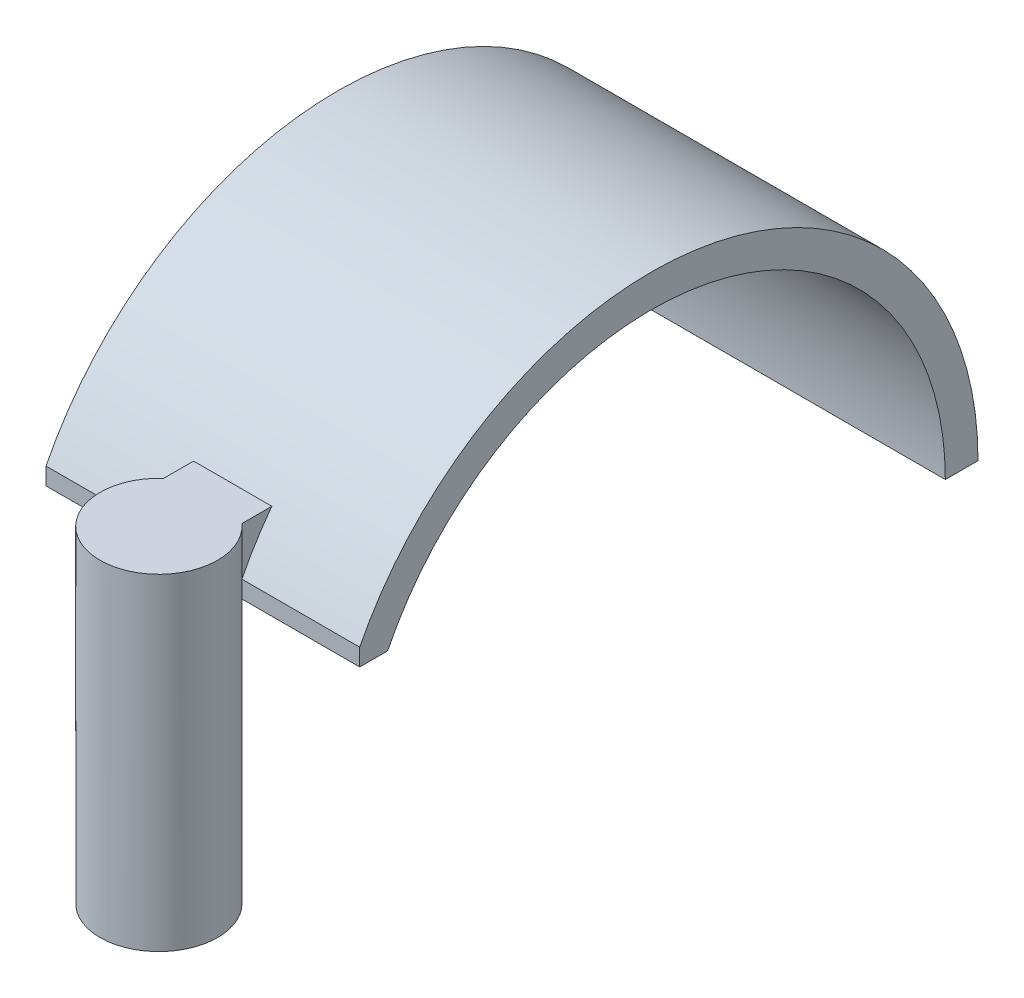
ISO-10303-21;
HEADER;
FILE_DESCRIPTION(('STEP AP214'),'2;1');
FILE_NAME('part.step','',(''),(''),'','','');
FILE_SCHEMA(('AUTOMOTIVE_DESIGN { 1 0 10303 214 1 1 1 1 }'));
ENDSEC;
DATA;
#1=APPLICATION_CONTEXT('core data for automotive mechanical design processes');
#2=APPLICATION_PROTOCOL_DEFINITION('international standard','automotive_design',2000,#1);
#3=PRODUCT_CONTEXT('',#1,'mechanical');
#4=PRODUCT('Part','Part','',(#3));
#5=PRODUCT_RELATED_PRODUCT_CATEGORY('part','',(#4));
#6=PRODUCT_DEFINITION_FORMATION('','',#4);
#7=PRODUCT_DEFINITION_CONTEXT('part definition',#1,'design');
#8=PRODUCT_DEFINITION('design','',#6,#7);
#9=PRODUCT_DEFINITION_SHAPE('','',#8);
#10=(LENGTH_UNIT() NAMED_UNIT(*) SI_UNIT(.MILLI.,.METRE.));
#11=(NAMED_UNIT(*) PLANE_ANGLE_UNIT() SI_UNIT($,.RADIAN.));
#12=(NAMED_UNIT(*) SI_UNIT($,.STERADIAN.) SOLID_ANGLE_UNIT());
#13=UNCERTAINTY_MEASURE_WITH_UNIT(LENGTH_MEASURE(1.E-05),#10,'distance_accuracy_value','');
#14=(GEOMETRIC_REPRESENTATION_CONTEXT(3) GLOBAL_UNCERTAINTY_ASSIGNED_CONTEXT((#13)) GLOBAL_UNIT_ASSIGNED_CONTEXT((#10,
#11,#12)) REPRESENTATION_CONTEXT('',''));
#15=CARTESIAN_POINT('',(0.,0.,0.));
#16=DIRECTION('',(0.,0.,1.));
#17=DIRECTION('',(1.,0.,0.));
#18=AXIS2_PLACEMENT_3D('',#15,#16,#17);
#19=CARTESIAN_POINT('',(0.,31.75,0.));
#20=DIRECTION('',(0.,1.,0.));
#21=DIRECTION('',(0.,0.,1.));
#22=AXIS2_PLACEMENT_3D('',#19,#20,#21);
#23=PLANE('',#22);
#24=DIRECTION('',(0.,0.,-1.));
#25=VECTOR('',#24,1.);
#26=CARTESIAN_POINT('',(3.80152390496232,31.75,0.));
#27=LINE('',#26,#25);
#28=CARTESIAN_POINT('',(3.80152390496232,31.75,-4.26727559456851));
#29=VERTEX_POINT('',#28);
#30=CARTESIAN_POINT('',(3.80152390496233,31.75,-7.17338182965068));
#31=VERTEX_POINT('',#30);
#32=EDGE_CURVE('E244',#29,#31,#27,.T.);
#33=ORIENTED_EDGE('',*,*,#32,.T.);
#34=DIRECTION('',(1.,0.,0.));
#35=VECTOR('',#34,1.);
#36=CARTESIAN_POINT('',(-15.2315239049623,31.75,-7.17338182965068));
#37=LINE('',#36,#35);
#38=CARTESIAN_POINT('',(-3.80152390496233,31.75,-7.17338182965068));
#39=VERTEX_POINT('',#38);
#40=EDGE_CURVE('E61',#31,#39,#37,.F.);
#41=ORIENTED_EDGE('',*,*,#40,.T.);
#42=DIRECTION('',(0.,0.,-1.));
#43=VECTOR('',#42,1.);
#44=CARTESIAN_POINT('',(-3.80152390496232,31.75,0.));
#45=LINE('',#44,#43);
#46=CARTESIAN_POINT('',(-3.80152390496232,31.75,-4.26727559456851));
#47=VERTEX_POINT('',#46);
#48=EDGE_CURVE('E242',#47,#39,#45,.T.);
#49=ORIENTED_EDGE('',*,*,#48,.F.);
#50=CARTESIAN_POINT('',(0.,31.75,0.));
#51=DIRECTION('',(0.,1.,0.));
#52=DIRECTION('',(0.,0.,1.));
#53=AXIS2_PLACEMENT_3D('',#50,#51,#52);
#54=CIRCLE('',#53,5.715);
#55=EDGE_CURVE('E246',#47,#29,#54,.T.);
#56=ORIENTED_EDGE('',*,*,#55,.T.);
#57=EDGE_LOOP('',(#33,#41,#49,#56));
#58=FACE_BOUND('',#57,.T.);
#59=ADVANCED_FACE('F39',(#58),#23,.T.);
#60=CARTESIAN_POINT('',(0.,25.4,2.54));
#61=DIRECTION('',(0.,0.,-1.));
#62=DIRECTION('',(-1.,0.,0.));
#63=AXIS2_PLACEMENT_3D('',#60,#61,#62);
#64=PLANE('',#63);
#65=DIRECTION('',(1.,0.,0.));
#66=VECTOR('',#65,1.);
#67=CARTESIAN_POINT('',(0.,0.,2.54));
#68=LINE('',#67,#66);
#69=CARTESIAN_POINT('',(-3.80152390496232,0.,2.54));
#70=VERTEX_POINT('',#69);
#71=CARTESIAN_POINT('',(3.80152390496232,0.,2.54));
#72=VERTEX_POINT('',#71);
#73=EDGE_CURVE('E211',#70,#72,#68,.T.);
#74=ORIENTED_EDGE('',*,*,#73,.F.);
#75=DIRECTION('',(0.,-1.,0.));
#76=VECTOR('',#75,1.);
#77=CARTESIAN_POINT('',(-3.80152390496232,25.4,2.54));
#78=LINE('',#77,#76);
#79=CARTESIAN_POINT('',(-3.80152390496232,25.4,2.54));
#80=VERTEX_POINT('',#79);
#81=EDGE_CURVE('E47',#80,#70,#78,.T.);
#82=ORIENTED_EDGE('',*,*,#81,.F.);
#83=DIRECTION('',(1.,0.,0.));
#84=VECTOR('',#83,1.);
#85=CARTESIAN_POINT('',(0.,25.4,2.54));
#86=LINE('',#85,#84);
#87=CARTESIAN_POINT('',(3.80152390496232,25.4,2.54));
#88=VERTEX_POINT('',#87);
#89=EDGE_CURVE('E217',#80,#88,#86,.T.);
#90=ORIENTED_EDGE('',*,*,#89,.T.);
#91=DIRECTION('',(0.,-1.,0.));
#92=VECTOR('',#91,1.);
#93=CARTESIAN_POINT('',(3.80152390496232,25.4,2.54));
#94=LINE('',#93,#92);
#95=EDGE_CURVE('E226',#88,#72,#94,.T.);
#96=ORIENTED_EDGE('',*,*,#95,.T.);
#97=EDGE_LOOP('',(#74,#82,#90,#96));
#98=FACE_BOUND('',#97,.T.);
#99=ADVANCED_FACE('F41',(#98),#64,.T.);
#100=CARTESIAN_POINT('',(0.,25.4,0.));
#101=DIRECTION('',(0.,-1.,0.));
#102=DIRECTION('',(0.,0.,-1.));
#103=AXIS2_PLACEMENT_3D('',#100,#101,#102);
#104=CYLINDRICAL_SURFACE('',#103,4.572);
#105=CARTESIAN_POINT('',(2.18584286706387,12.7230177237081,-4.01562883749308));
#106=CARTESIAN_POINT('',(2.18584653667265,13.002465114886,-4.01562942234987));
#107=CARTESIAN_POINT('',(2.17835590291322,13.281928837314,-4.01973309464494));
#108=CARTESIAN_POINT('',(2.14787603450806,13.8399383054706,-4.03610039648494));
#109=CARTESIAN_POINT('',(2.12487745050951,14.1184833955236,-4.04836894837206));
#110=CARTESIAN_POINT('',(2.06165121548538,14.673892937203,-4.08094307474587));
#111=CARTESIAN_POINT('',(2.0213837669837,14.9507519992166,-4.1012672057075));
#112=CARTESIAN_POINT('',(1.94558751520623,15.3625556828678,-4.13746595619681));
#113=CARTESIAN_POINT('',(1.91776943447696,15.4991926706699,-4.15047840807066));
#114=CARTESIAN_POINT('',(1.85633410239752,15.7709603143807,-4.17831973423238));
#115=CARTESIAN_POINT('',(1.82271794703769,15.9060912498434,-4.19314826507969));
#116=CARTESIAN_POINT('',(1.74873619472138,16.174665249426,-4.22453855084156));
#117=CARTESIAN_POINT('',(1.70835429381392,16.308103377984,-4.24110445548028));
#118=CARTESIAN_POINT('',(1.61966883746979,16.5722551826659,-4.27576105089523));
#119=CARTESIAN_POINT('',(1.57136014010371,16.7029670278664,-4.29385272767746));
#120=CARTESIAN_POINT('',(1.46539229979324,16.9597483213198,-4.33116150993634));
#121=CARTESIAN_POINT('',(1.40777496672752,17.0858355699258,-4.3503733483948));
#122=CARTESIAN_POINT('',(1.28072961937026,17.3317141785185,-4.38945954472904));
#123=CARTESIAN_POINT('',(1.21132219883515,17.4515160475785,-4.40933269962481));
#124=CARTESIAN_POINT('',(1.07124343907828,17.6601068228244,-4.44520522663886));
#125=CARTESIAN_POINT('',(1.00310748127726,17.7505687766863,-4.46125055066524));
#126=CARTESIAN_POINT('',(0.854075455758539,17.9205340878717,-4.49216262541639));
#127=CARTESIAN_POINT('',(0.773226916845334,18.0000762751379,-4.50703346790554));
#128=CARTESIAN_POINT('',(0.635873692980607,18.1092702414244,-4.52783290674892));
#129=CARTESIAN_POINT('',(0.584652019478198,18.1453251605132,-4.53478640992185));
#130=CARTESIAN_POINT('',(0.477407997406217,18.2098070667941,-4.54732592875937));
#131=CARTESIAN_POINT('',(0.421390775294227,18.2382420686077,-4.55291338068859));
#132=CARTESIAN_POINT('',(0.313583471498438,18.2817286062246,-4.5615050028127));
#133=CARTESIAN_POINT('',(0.262364479404823,18.2981255617358,-4.56476677176543));
#134=CARTESIAN_POINT('',(0.157842875969195,18.3222324967905,-4.5695729305995));
#135=CARTESIAN_POINT('',(0.104542396536296,18.3299511353167,-4.57111903230567));
#136=CARTESIAN_POINT('',(-0.00279764088474668,18.3359243218405,-4.57231489683408));
#137=CARTESIAN_POINT('',(-0.0568390432319614,18.3341479003714,-4.5719584542472));
#138=CARTESIAN_POINT('',(-0.16375149555785,18.3212585086521,-4.56938038788533));
#139=CARTESIAN_POINT('',(-0.216621705064083,18.3101390430577,-4.56715746652309));
#140=CARTESIAN_POINT('',(-0.329382865079766,18.2768099465877,-4.56053161825985));
#141=CARTESIAN_POINT('',(-0.388752137248691,18.2529230932345,-4.55580028170942));
#142=CARTESIAN_POINT('',(-0.502747355509066,18.1960265579992,-4.54463732950165));
#143=CARTESIAN_POINT('',(-0.55736448134094,18.1630003685432,-4.53820263814718));
#144=CARTESIAN_POINT('',(-0.690511198564511,18.0700114397264,-4.52029643594291));
#145=CARTESIAN_POINT('',(-0.76554687567868,18.0052564653811,-4.50800821156896));
#146=CARTESIAN_POINT('',(-0.905067128476575,17.8655376100681,-4.48208549827332));
#147=CARTESIAN_POINT('',(-0.969522867847181,17.7905468159376,-4.46844748723405));
#148=CARTESIAN_POINT('',(-1.08818417875453,17.6358664197841,-4.44101829920592));
#149=CARTESIAN_POINT('',(-1.14259763677523,17.5563316375143,-4.42723854222755));
#150=CARTESIAN_POINT('',(-1.24450721531439,17.392903499053,-4.39967861055631));
#151=CARTESIAN_POINT('',(-1.29199653993709,17.3090059690002,-4.38589844855467));
#152=CARTESIAN_POINT('',(-1.38121358684339,17.1380008951179,-4.35862461507628));
#153=CARTESIAN_POINT('',(-1.42293126921037,17.0508880834604,-4.34513147653699));
#154=CARTESIAN_POINT('',(-1.5013950466125,16.8743576253115,-4.31864666025292));
#155=CARTESIAN_POINT('',(-1.53813924400199,16.7849391144799,-4.30565517525901));
#156=CARTESIAN_POINT('',(-1.61209504912308,16.5919018732059,-4.27856210883826));
#157=CARTESIAN_POINT('',(-1.64867056031187,16.4880273117763,-4.26455495960987));
#158=CARTESIAN_POINT('',(-1.71700448328107,16.2785731858011,-4.23750170341181));
#159=CARTESIAN_POINT('',(-1.74876173012099,16.1729932157342,-4.22445582924624));
#160=CARTESIAN_POINT('',(-1.83776034508615,15.8541253457404,-4.1868868060397));
#161=CARTESIAN_POINT('',(-1.88866955576615,15.6388701134727,-4.16395494333886));
#162=CARTESIAN_POINT('',(-1.97694819607502,15.2047694724761,-4.12276547099754));
#163=CARTESIAN_POINT('',(-2.01428810703622,14.9859173064533,-4.10451807695213));
#164=CARTESIAN_POINT('',(-2.07726862036677,14.5462963778206,-4.07300597088594));
#165=CARTESIAN_POINT('',(-2.10291452316677,14.3255285298456,-4.05973900191862));
#166=CARTESIAN_POINT('',(-2.14036565505374,13.9196225615315,-4.04009610867815));
#167=CARTESIAN_POINT('',(-2.15376326717747,13.7346642359548,-4.03294114159084));
#168=CARTESIAN_POINT('',(-2.17371338356821,13.3642554224575,-4.02222377549254));
#169=CARTESIAN_POINT('',(-2.18026517371692,13.1788048852146,-4.01866175127882));
#170=CARTESIAN_POINT('',(-2.18672487227429,12.807548539045,-4.01515016685781));
#171=CARTESIAN_POINT('',(-2.1866253379953,12.621742564783,-4.01520465344715));
#172=CARTESIAN_POINT('',(-2.17976049171975,12.2502904532068,-4.01893567332067));
#173=CARTESIAN_POINT('',(-2.1729952421466,12.0646443144119,-4.02261217268525));
#174=CARTESIAN_POINT('',(-2.15255516047413,11.6931303971363,-4.03358728639332));
#175=CARTESIAN_POINT('',(-2.13885426234135,11.5072644411157,-4.04089956310885));
#176=CARTESIAN_POINT('',(-2.10409820721896,11.1364221833834,-4.05910601386534));
#177=CARTESIAN_POINT('',(-2.08304431558957,10.9514457341473,-4.06999957159275));
#178=CARTESIAN_POINT('',(-2.03291117729375,10.5831021789726,-4.09527117547867));
#179=CARTESIAN_POINT('',(-2.00384435990033,10.3997330307288,-4.10964382086459));
#180=CARTESIAN_POINT('',(-1.93661620119437,10.0350004757189,-4.14175040033796));
#181=CARTESIAN_POINT('',(-1.89845761462421,9.85363647878994,-4.15948331595459));
#182=CARTESIAN_POINT('',(-1.81419233757527,9.50510520298835,-4.1968899693905));
#183=CARTESIAN_POINT('',(-1.76873631798269,9.3377623414739,-4.21637154798725));
#184=CARTESIAN_POINT('',(-1.66643681688821,9.00659564810464,-4.25784355419843));
#185=CARTESIAN_POINT('',(-1.60957667038092,8.84277735926902,-4.27983763287779));
#186=CARTESIAN_POINT('',(-1.48235574128184,8.52282565011535,-4.32554958460597));
#187=CARTESIAN_POINT('',(-1.41216590911351,8.36662341106125,-4.34924349059094));
#188=CARTESIAN_POINT('',(-1.29325141183479,8.13982853281948,-4.38547171706163));
#189=CARTESIAN_POINT('',(-1.25140518770981,8.06557384144637,-4.39764599189622));
#190=CARTESIAN_POINT('',(-1.16236056707806,7.92037469128439,-4.42201788378613));
#191=CARTESIAN_POINT('',(-1.11516574286464,7.84942806723907,-4.43421547997463));
#192=CARTESIAN_POINT('',(-1.01312408897523,7.71026263136985,-4.45865359871207));
#193=CARTESIAN_POINT('',(-0.958108814992517,7.64216443521195,-4.47088683169427));
#194=CARTESIAN_POINT('',(-0.840120240757287,7.51288929555158,-4.49455282639805));
#195=CARTESIAN_POINT('',(-0.777147168711618,7.45171215366843,-4.5059856110596));
#196=CARTESIAN_POINT('',(-0.656521380112374,7.35184177292224,-4.52493610575105));
#197=CARTESIAN_POINT('',(-0.600606072092819,7.31113729423984,-4.53276842427427));
#198=CARTESIAN_POINT('',(-0.482935241489537,7.23885977258856,-4.5468061419849));
#199=CARTESIAN_POINT('',(-0.421191217335959,7.2072692301003,-4.55301465683915));
#200=CARTESIAN_POINT('',(-0.307534297722216,7.16224798163791,-4.56191376299647));
#201=CARTESIAN_POINT('',(-0.256664764875583,7.14630436038201,-4.56508637503913));
#202=CARTESIAN_POINT('',(-0.152924761245142,7.12298983792415,-4.56973559601395));
#203=CARTESIAN_POINT('',(-0.100056464433855,7.11560988447453,-4.57121399579708));
#204=CARTESIAN_POINT('',(0.00635324075342178,7.11015629894274,-4.57230587995706));
#205=CARTESIAN_POINT('',(0.0598962163958213,7.11211128247542,-4.57191362998881));
#206=CARTESIAN_POINT('',(0.165809691435376,7.12517750294435,-4.56930034058071));
#207=CARTESIAN_POINT('',(0.218179305924353,7.13629542632507,-4.56707796565025));
#208=CARTESIAN_POINT('',(0.330506555100457,7.16963259977448,-4.56045089587826));
#209=CARTESIAN_POINT('',(0.38991450953371,7.19361354089294,-4.5557013257726));
#210=CARTESIAN_POINT('',(0.503973108700263,7.25070178342074,-4.54450202303087));
#211=CARTESIAN_POINT('',(0.558614748658722,7.28382588729933,-4.53804916120478));
#212=CARTESIAN_POINT('',(0.691876838247241,7.37710876224355,-4.52008942101484));
#213=CARTESIAN_POINT('',(0.76698670803408,7.44207194986785,-4.5077645067355));
#214=CARTESIAN_POINT('',(0.906621725718994,7.58220745514178,-4.48177223715193));
#215=CARTESIAN_POINT('',(0.971118768483044,7.65740594672946,-4.46810146583658));
#216=CARTESIAN_POINT('',(1.08987788226179,7.81254001378446,-4.44060391621938));
#217=CARTESIAN_POINT('',(1.14434348248098,7.89232431183153,-4.42678820219436));
#218=CARTESIAN_POINT('',(1.2463385906459,8.05625459200579,-4.3991607678669));
#219=CARTESIAN_POINT('',(1.29386126522529,8.14040476221749,-4.38534906467502));
#220=CARTESIAN_POINT('',(1.38314758089772,8.31194921475461,-4.35801182402649));
#221=CARTESIAN_POINT('',(1.42489892489493,8.39934993548428,-4.34448694805498));
#222=CARTESIAN_POINT('',(1.50341513410742,8.57645859692363,-4.31794416431499));
#223=CARTESIAN_POINT('',(1.54017806074626,8.66616741857811,-4.30492645503235));
#224=CARTESIAN_POINT('',(1.61419709924876,8.8599222652195,-4.277770106785));
#225=CARTESIAN_POINT('',(1.65081003484725,8.96422633489049,-4.26372754171869));
#226=CARTESIAN_POINT('',(1.71919662261005,9.17454252589277,-4.2366131061034));
#227=CARTESIAN_POINT('',(1.75096910243166,9.28055505415419,-4.22354147110213));
#228=CARTESIAN_POINT('',(1.83998687327212,9.60073043606862,-4.18590928390833));
#229=CARTESIAN_POINT('',(1.89087095708423,9.81686313676003,-4.16295513853921));
#230=CARTESIAN_POINT('',(1.9789366396211,10.2522233113079,-4.12180950356194));
#231=CARTESIAN_POINT('',(2.01611994284392,10.4714503966697,-4.10361742159266));
#232=CARTESIAN_POINT('',(2.07879717629177,10.9119423841606,-4.07222441801957));
#233=CARTESIAN_POINT('',(2.10428916514675,11.1332076185111,-4.05902432541103));
#234=CARTESIAN_POINT('',(2.14530429564504,11.5823251303122,-4.03749909786022));
#235=CARTESIAN_POINT('',(2.16056969071798,11.8102066500689,-4.02930044080684));
#236=CARTESIAN_POINT('',(2.18083413420927,12.2663946364563,-4.01836685088862));
#237=CARTESIAN_POINT('',(2.18583986888218,12.4947007292126,-4.01562835964734));
#238=CARTESIAN_POINT('',(2.18584286706387,12.7230177237081,-4.01562883749308));
#239=B_SPLINE_CURVE_WITH_KNOTS('',3,(#105,#106,#107,#108,#109,#110,#111,#112,#113,#114,#115,
#116,#117,#118,#119,#120,#121,#122,#123,#124,#125,#126,#127,#128,#129,#130,#131,#132,#133,#134,
#135,#136,#137,#138,#139,#140,#141,#142,#143,#144,#145,#146,#147,#148,#149,#150,#151,#152,#153,
#154,#155,#156,#157,#158,#159,#160,#161,#162,#163,#164,#165,#166,#167,#168,#169,#170,#171,#172,
#173,#174,#175,#176,#177,#178,#179,#180,#181,#182,#183,#184,#185,#186,#187,#188,#189,#190,#191,
#192,#193,#194,#195,#196,#197,#198,#199,#200,#201,#202,#203,#204,#205,#206,#207,#208,#209,#210,
#211,#212,#213,#214,#215,#216,#217,#218,#219,#220,#221,#222,#223,#224,#225,#226,#227,#228,#229,
#230,#231,#232,#233,#234,#235,#236,#237,#238),.UNSPECIFIED.,.T.,.F.,(4,2,2,2,2,2,2,2,2,2,2,2,2,
2,2,2,2,2,2,2,2,2,2,2,2,2,2,2,2,2,2,2,2,2,2,2,2,2,2,2,2,2,2,2,2,2,2,2,2,2,2,2,2,2,2,2,2,2,2,2,2,
2,2,2,2,2,4),(0.,0.838229792310847,1.67696538461759,2.51764438584965,2.93767208189983,
3.35762046838212,3.77859578966347,4.19984527534526,4.61925278501338,5.03793510958939,
5.38031793297566,5.72144985400448,5.91002147624972,6.09839397356219,6.25935452961449,
6.42015434079066,6.58147894243719,6.74291579086421,6.9343599491861,7.12615217885089,
7.42408481477162,7.72281646571626,8.01441987537754,8.30630758860257,8.5986968298481,
8.89119732033748,9.22408834901636,9.55705973492488,10.2235186867641,10.8914188957548,
11.5590160703751,12.1156001137741,12.6722422111484,13.2295071893656,13.7867669489311,
14.3461367641703,14.9054103660999,15.4638212837147,16.0220632214133,16.5452020700119,
17.0691110326798,17.5867064863819,17.8448302195807,18.1027825585713,18.3675111000521,
18.6322320515989,18.8404001136002,19.0481657740729,19.2077201519204,19.3671057183106,
19.5269801834268,19.6869714166595,19.8786288644302,20.0706408949671,20.369155841944,
20.6684490251022,20.9607658135717,21.2533683954088,21.5465851259579,21.839915480717,
22.1740619302548,22.5082891807594,23.1772831890555,23.8461939404671,24.5152157258902,
25.2005216488361,25.8853808134547),.UNSPECIFIED.);
#240=CARTESIAN_POINT('',(2.18584286706387,12.7230177237081,-4.01562883749308));
#241=VERTEX_POINT('',#240);
#242=EDGE_CURVE('E133',#241,#241,#239,.T.);
#243=ORIENTED_EDGE('',*,*,#242,.F.);
#244=EDGE_LOOP('',(#243));
#245=FACE_BOUND('',#244,.T.);
#246=CARTESIAN_POINT('',(0.,0.,0.));
#247=DIRECTION('',(0.,1.,0.));
#248=DIRECTION('',(0.,0.,1.));
#249=AXIS2_PLACEMENT_3D('',#246,#247,#248);
#250=CIRCLE('',#249,4.572);
#251=EDGE_CURVE('E218',#72,#70,#250,.T.);
#252=ORIENTED_EDGE('',*,*,#251,.F.);
#253=ORIENTED_EDGE('',*,*,#95,.F.);
#254=CARTESIAN_POINT('',(0.,25.4,0.));
#255=DIRECTION('',(0.,1.,0.));
#256=DIRECTION('',(0.,0.,1.));
#257=AXIS2_PLACEMENT_3D('',#254,#255,#256);
#258=CIRCLE('',#257,4.572);
#259=EDGE_CURVE('E221',#88,#80,#258,.T.);
#260=ORIENTED_EDGE('',*,*,#259,.T.);
#261=ORIENTED_EDGE('',*,*,#81,.T.);
#262=EDGE_LOOP('',(#252,#253,#260,#261));
#263=FACE_BOUND('',#262,.T.);
#264=ADVANCED_FACE('F206',(#245,#263),#104,.F.);
#265=CARTESIAN_POINT('',(0.,25.4,0.));
#266=DIRECTION('',(0.,-1.,0.));
#267=DIRECTION('',(0.,0.,-1.));
#268=AXIS2_PLACEMENT_3D('',#265,#266,#267);
#269=CYLINDRICAL_SURFACE('',#268,5.715);
#270=DIRECTION('',(0.,-1.,0.));
#271=VECTOR('',#270,1.);
#272=CARTESIAN_POINT('',(-3.80152390496232,25.4,-4.26727559456851));
#273=LINE('',#272,#271);
#274=CARTESIAN_POINT('',(-3.80152390496232,16.5069688434392,-4.26727559456851));
#275=VERTEX_POINT('',#274);
#276=CARTESIAN_POINT('',(-3.80152390496232,8.939066603977,-4.26727559456851));
#277=VERTEX_POINT('',#276);
#278=EDGE_CURVE('E128',#275,#277,#273,.T.);
#279=ORIENTED_EDGE('',*,*,#278,.T.);
#280=CARTESIAN_POINT('',(-3.80152390496232,8.93906660397696,-4.26727559456851));
#281=CARTESIAN_POINT('',(-3.77916722321024,8.79004658918243,-4.28718295326354));
#282=CARTESIAN_POINT('',(-3.75518891827662,8.64141766701137,-4.3082380835679));
#283=CARTESIAN_POINT('',(-3.70369347650735,8.34508252031717,-4.35259175176505));
#284=CARTESIAN_POINT('',(-3.67617567715196,8.19737647397842,-4.37589070944998));
#285=CARTESIAN_POINT('',(-3.6171957393863,7.90249319338586,-4.4247702541241));
#286=CARTESIAN_POINT('',(-3.58571821818169,7.75532045870107,-4.45035962056976));
#287=CARTESIAN_POINT('',(-3.51854453804572,7.46234913093787,-4.50365348493222));
#288=CARTESIAN_POINT('',(-3.4828486269475,7.31655045767534,-4.53135785855715));
#289=CARTESIAN_POINT('',(-3.36811768285146,6.87886052356411,-4.6180480650659));
#290=CARTESIAN_POINT('',(-3.28195817074216,6.58935306790449,-4.68016581705406));
#291=CARTESIAN_POINT('',(-3.13532547358721,6.16258942048884,-4.7785315026239));
#292=CARTESIAN_POINT('',(-3.08359337118347,6.02168521369471,-4.81215830729404));
#293=CARTESIAN_POINT('',(-2.97357407756865,5.74284363455184,-4.88091254207073));
#294=CARTESIAN_POINT('',(-2.91528853927166,5.60490552450041,-4.91603959240387));
#295=CARTESIAN_POINT('',(-2.81198707107236,5.37811957561845,-4.97556238189456));
#296=CARTESIAN_POINT('',(-2.76903086624826,5.28824609294558,-4.99962886852589));
#297=CARTESIAN_POINT('',(-2.67952708102005,5.11041682606575,-5.04816274459415));
#298=CARTESIAN_POINT('',(-2.6329793441557,5.02246112561869,-5.07263015146003));
#299=CARTESIAN_POINT('',(-2.48748674064041,4.76199976368416,-5.14640765378215));
#300=CARTESIAN_POINT('',(-2.38264956400776,4.59280348105946,-5.19611843993852));
#301=CARTESIAN_POINT('',(-2.15331386553364,4.26575519076085,-5.29530365095162));
#302=CARTESIAN_POINT('',(-2.0286554865793,4.10801208062886,-5.34477245635537));
#303=CARTESIAN_POINT('',(-1.75679429954086,3.81190470701278,-5.44018327238429));
#304=CARTESIAN_POINT('',(-1.60963900231046,3.67350075376133,-5.48613241611289));
#305=CARTESIAN_POINT('',(-1.34713311731603,3.47040142317493,-5.55496952968728));
#306=CARTESIAN_POINT('',(-1.2391712855832,3.39702750174301,-5.58023572972845));
#307=CARTESIAN_POINT('',(-1.01282145486247,3.26632423295834,-5.62571932762555));
#308=CARTESIAN_POINT('',(-0.894438898042558,3.20898657534689,-5.64593933991271));
#309=CARTESIAN_POINT('',(-0.647244908463987,3.11414660182222,-5.6796119502792));
#310=CARTESIAN_POINT('',(-0.518327524852449,3.07688459115216,-5.6929824708152));
#311=CARTESIAN_POINT('',(-0.255208676077614,3.02730462491829,-5.71081259946936));
#312=CARTESIAN_POINT('',(-0.121015310010465,3.0149498501001,-5.71528536061811));
#313=CARTESIAN_POINT('',(0.128313932962225,3.01650000121058,-5.71472695018143));
#314=CARTESIAN_POINT('',(0.243487875765829,3.02697097801221,-5.71093857063303));
#315=CARTESIAN_POINT('',(0.470206292222752,3.06637410223745,-5.69675798287736));
#316=CARTESIAN_POINT('',(0.581748607805496,3.09531702339349,-5.68636192076421));
#317=CARTESIAN_POINT('',(0.822668587420549,3.17757428077377,-5.65705491173446));
#318=CARTESIAN_POINT('',(0.950503375785724,3.23487449020796,-5.63676539653692));
#319=CARTESIAN_POINT('',(1.19461512707457,3.36838546917619,-5.59013831164734));
#320=CARTESIAN_POINT('',(1.31087160745604,3.44462894605232,-5.56379028729242));
#321=CARTESIAN_POINT('',(1.58868846415666,3.65448360040637,-5.49247438850627));
#322=CARTESIAN_POINT('',(1.74252539153924,3.79735430971164,-5.4449308306304));
#323=CARTESIAN_POINT('',(2.02593292739279,4.1041095048114,-5.34597377415513));
#324=CARTESIAN_POINT('',(2.15544241004407,4.26804522540257,-5.29455097063223));
#325=CARTESIAN_POINT('',(2.3844227712444,4.59605474779058,-5.19518898987873));
#326=CARTESIAN_POINT('',(2.4854693119863,4.75906424199499,-5.14730096171967));
#327=CARTESIAN_POINT('',(2.67305437977674,5.09356436286307,-5.05243106053368));
#328=CARTESIAN_POINT('',(2.75958037166316,5.26506215354251,-5.0054500011097));
#329=CARTESIAN_POINT('',(2.92044451446355,5.61453323136497,-4.91333103629233));
#330=CARTESIAN_POINT('',(2.99475805424456,5.79251873238199,-4.86819698720291));
#331=CARTESIAN_POINT('',(3.13278558993521,6.15308891527541,-4.78053914211965));
#332=CARTESIAN_POINT('',(3.19650217077671,6.33567246299432,-4.73801471115955));
#333=CARTESIAN_POINT('',(3.31580432313206,6.70752739156137,-4.65532151470748));
#334=CARTESIAN_POINT('',(3.37123484503805,6.89685962029441,-4.61520449795488));
#335=CARTESIAN_POINT('',(3.47388568439895,7.27845411757621,-4.53844094741955));
#336=CARTESIAN_POINT('',(3.52110438188224,7.47071695613729,-4.50179509905257));
#337=CARTESIAN_POINT('',(3.60832965931896,7.85767523564703,-4.43218890894095));
#338=CARTESIAN_POINT('',(3.64833093723011,8.05237235349451,-4.39923128332433));
#339=CARTESIAN_POINT('',(3.72186264666266,8.44360587486338,-4.33719513332684));
#340=CARTESIAN_POINT('',(3.75539232063416,8.64014249089199,-4.30811706319995));
#341=CARTESIAN_POINT('',(3.84738779074046,9.2327904996554,-4.2267773849991));
#342=CARTESIAN_POINT('',(3.89708349743993,9.63112836298797,-4.18055690024647));
#343=CARTESIAN_POINT('',(3.97672382469674,10.4311084035112,-4.10485548104066));
#344=CARTESIAN_POINT('',(4.00667546599222,10.832749354674,-4.07536859685171));
#345=CARTESIAN_POINT('',(4.05133101778966,11.6835594606784,-4.03101473538178));
#346=CARTESIAN_POINT('',(4.06391806147933,12.1329482259556,-4.01818736631926));
#347=CARTESIAN_POINT('',(4.06828332217996,13.0320376340269,-4.01376137857412));
#348=CARTESIAN_POINT('',(4.06005530431165,13.4817383299212,-4.02216912058989));
#349=CARTESIAN_POINT('',(4.02217432631756,14.3775311393317,-4.06006224045816));
#350=CARTESIAN_POINT('',(3.99261113749883,14.8236304788665,-4.08945929675111));
#351=CARTESIAN_POINT('',(3.93037406951673,15.4895653705956,-4.14899497747577));
#352=CARTESIAN_POINT('',(3.9066519596805,15.7109701151465,-4.17140836336194));
#353=CARTESIAN_POINT('',(3.85269675820778,16.152399502276,-4.22129129022817));
#354=CARTESIAN_POINT('',(3.82246396633285,16.3724242079139,-4.24876059841754));
#355=CARTESIAN_POINT('',(3.73307671324671,16.951790851679,-4.32793091694988));
#356=CARTESIAN_POINT('',(3.66782987600786,17.3096793365395,-4.38385069730756));
#357=CARTESIAN_POINT('',(3.552146578192,17.8418164900211,-4.47726480271162));
#358=CARTESIAN_POINT('',(3.5104947636978,18.0188332224497,-4.51008246821241));
#359=CARTESIAN_POINT('',(3.42051152599161,18.3705678006487,-4.5787046792622));
#360=CARTESIAN_POINT('',(3.37218074596474,18.5452858660087,-4.61450893707059));
#361=CARTESIAN_POINT('',(3.24928278715795,18.9540608576332,-4.70223231490466));
#362=CARTESIAN_POINT('',(3.17152260214668,19.1869265068367,-4.75532565009093));
#363=CARTESIAN_POINT('',(2.99921292130983,19.6456402669155,-4.86584491986016));
#364=CARTESIAN_POINT('',(2.90464686925194,19.8714811972387,-4.92327509448206));
#365=CARTESIAN_POINT('',(2.695815261117,20.3111836970779,-5.04064600402021));
#366=CARTESIAN_POINT('',(2.58171030483278,20.5251254399513,-5.10056347089828));
#367=CARTESIAN_POINT('',(2.39199375260952,20.8342266323807,-5.19080219106736));
#368=CARTESIAN_POINT('',(2.32572902277809,20.9352070291599,-5.22091518215811));
#369=CARTESIAN_POINT('',(2.18626523275807,21.1323273151954,-5.28083742497615));
#370=CARTESIAN_POINT('',(2.11307016436413,21.2284699426612,-5.31064684073111));
#371=CARTESIAN_POINT('',(1.99061425806028,21.3764353495751,-5.35733468656332));
#372=CARTESIAN_POINT('',(1.94386292269622,21.4302500400084,-5.37449797129723));
#373=CARTESIAN_POINT('',(1.84752918726524,21.5354234959158,-5.40837019398653));
#374=CARTESIAN_POINT('',(1.79794687207833,21.5867823349377,-5.42507914554185));
#375=CARTESIAN_POINT('',(1.64461853668286,21.7367047714335,-5.47430360080751));
#376=CARTESIAN_POINT('',(1.53633460353175,21.831060664591,-5.50589969271559));
#377=CARTESIAN_POINT('',(1.30571972727718,22.005336047366,-5.56512684582968));
#378=CARTESIAN_POINT('',(1.18325669974325,22.0850983710341,-5.59271414889791));
#379=CARTESIAN_POINT('',(0.92558686770161,22.2233735560032,-5.64105989737903));
#380=CARTESIAN_POINT('',(0.790407445905597,22.2819308167447,-5.66183260259971));
#381=CARTESIAN_POINT('',(0.543822632590987,22.3610829696391,-5.69007764083741));
#382=CARTESIAN_POINT('',(0.434495852385704,22.3874154629328,-5.69954539687423));
#383=CARTESIAN_POINT('',(0.212691787449071,22.4223274967884,-5.71211741864717));
#384=CARTESIAN_POINT('',(0.100217052367927,22.430921005885,-5.71522669134282));
#385=CARTESIAN_POINT('',(-0.124720088314294,22.4295929296581,-5.71474704519487));
#386=CARTESIAN_POINT('',(-0.23718236512458,22.4196525117202,-5.71115131329037));
#387=CARTESIAN_POINT('',(-0.458732196442476,22.3821251340661,-5.69764367002821));
#388=CARTESIAN_POINT('',(-0.567817158297575,22.3545249532417,-5.68772702649588));
#389=CARTESIAN_POINT('',(-0.805886766662701,22.2752204021158,-5.65945365244328));
#390=CARTESIAN_POINT('',(-0.93328004710153,22.2192931271907,-5.63963312372761));
#391=CARTESIAN_POINT('',(-1.1767247936213,22.0885550989536,-5.59392285125211));
#392=CARTESIAN_POINT('',(-1.29275618378813,22.0137117283478,-5.56802262974423));
#393=CARTESIAN_POINT('',(-1.56939396680898,21.80794646669,-5.49798008470197));
#394=CARTESIAN_POINT('',(-1.72250372783221,21.6679050750002,-5.45127649700451));
#395=CARTESIAN_POINT('',(-2.00483412603048,21.3668871613329,-5.35390063337875));
#396=CARTESIAN_POINT('',(-2.13399760222878,21.2058620701828,-5.30321926214534));
#397=CARTESIAN_POINT('',(-2.36201073236421,20.8842295981672,-5.20539349166387));
#398=CARTESIAN_POINT('',(-2.46250231696083,20.7247451757091,-5.15831369217707));
#399=CARTESIAN_POINT('',(-2.64927155968612,20.3973536784618,-5.06492786027902));
#400=CARTESIAN_POINT('',(-2.7355366454512,20.2294393230016,-5.01862254442517));
#401=CARTESIAN_POINT('',(-2.89625194942969,19.8868466702371,-4.92762585612205));
#402=CARTESIAN_POINT('',(-2.97065496030995,19.7121446273966,-4.88294145345944));
#403=CARTESIAN_POINT('',(-3.10903130832604,19.358050582229,-4.79602103665519));
#404=CARTESIAN_POINT('',(-3.17300200274854,19.1786574048574,-4.75378564463745));
#405=CARTESIAN_POINT('',(-3.29894032299725,18.7948882604963,-4.6674104514271));
#406=CARTESIAN_POINT('',(-3.35978035058142,18.5900627107773,-4.62363425518911));
#407=CARTESIAN_POINT('',(-3.47177518871996,18.1769264210355,-4.54013947326758));
#408=CARTESIAN_POINT('',(-3.52292717012301,17.9686146822276,-4.50042207440846));
#409=CARTESIAN_POINT('',(-3.61608199588146,17.5524460031033,-4.42591246435809));
#410=CARTESIAN_POINT('',(-3.65820929429687,17.3446281485157,-4.39105593675915));
#411=CARTESIAN_POINT('',(-3.73512814157782,16.9271133146075,-4.32579336286629));
#412=CARTESIAN_POINT('',(-3.76992542032576,16.7174179376369,-4.2953838460694));
#413=CARTESIAN_POINT('',(-3.80152390496276,16.5069688434394,-4.26727559456852));
#414=B_SPLINE_CURVE_WITH_KNOTS('',3,(#280,#281,#282,#283,#284,#285,#286,#287,#288,#289,#290,
#291,#292,#293,#294,#295,#296,#297,#298,#299,#300,#301,#302,#303,#304,#305,#306,#307,#308,#309,
#310,#311,#312,#313,#314,#315,#316,#317,#318,#319,#320,#321,#322,#323,#324,#325,#326,#327,#328,
#329,#330,#331,#332,#333,#334,#335,#336,#337,#338,#339,#340,#341,#342,#343,#344,#345,#346,#347,
#348,#349,#350,#351,#352,#353,#354,#355,#356,#357,#358,#359,#360,#361,#362,#363,#364,#365,#366,
#367,#368,#369,#370,#371,#372,#373,#374,#375,#376,#377,#378,#379,#380,#381,#382,#383,#384,#385,
#386,#387,#388,#389,#390,#391,#392,#393,#394,#395,#396,#397,#398,#399,#400,#401,#402,#403,#404,
#405,#406,#407,#408,#409,#410,#411,#412,#413),.UNSPECIFIED.,.F.,.F.,(4,2,2,2,2,2,2,2,2,2,2,2,2,
2,2,2,2,2,2,2,2,2,2,2,2,2,2,2,2,2,2,2,2,2,2,2,2,2,2,2,2,2,2,2,2,2,2,2,2,2,2,2,2,2,2,2,2,2,2,2,2,
2,2,2,2,2,4),(0.,0.455984495889523,0.912054467135064,1.36995431805902,1.82782728043103,
2.75184952544245,3.21318341574218,3.67440120786912,3.98175801380956,4.28912821690175,
4.90354410438644,5.52319318680868,6.14155127343374,6.53925479542515,6.93675183734033,
7.33890677939663,7.74046679655973,8.08581290924049,8.4313606287999,8.85367521204739,
9.27672409113489,9.91889237482033,10.5626532150709,11.1548138550695,11.7474830891844,
12.3413324292097,12.9350366975465,13.5387420829304,14.1425664283537,14.7468325634978,
15.3511693896933,16.5623674127301,17.7731345165237,19.1213459188989,20.4699612081682,
21.8129348127739,22.4841903701629,23.1554150285445,24.2585427360111,24.8127805777196,
25.3669650834071,26.1199011917006,26.8735832058546,27.6213441453572,27.9945598721952,
28.3675619238811,28.5874426630968,28.8073168131848,29.2472773154499,29.6917280458713,
30.1352427240054,30.472334985142,30.8091617021009,31.1463308605118,31.4837527388572,
31.903021520429,32.3230182451028,32.9574983097288,33.5934739397281,34.175508375718,
34.7580544474115,35.342863923096,35.927821313307,36.581821057948,37.2360114933571,
37.8804983853716,38.5244795964151),.UNSPECIFIED.);
#415=EDGE_CURVE('E137',#277,#275,#414,.T.);
#416=ORIENTED_EDGE('',*,*,#415,.T.);
#417=EDGE_LOOP('',(#279,#416));
#418=FACE_BOUND('',#417,.T.);
#419=CARTESIAN_POINT('',(0.,25.4,0.));
#420=DIRECTION('',(0.,1.,0.));
#421=DIRECTION('',(0.,0.,1.));
#422=AXIS2_PLACEMENT_3D('',#419,#420,#421);
#423=CIRCLE('',#422,5.715);
#424=CARTESIAN_POINT('',(3.80152390496232,25.4,-4.26727559456851));
#425=VERTEX_POINT('',#424);
#426=CARTESIAN_POINT('',(-3.80152390496232,25.4,-4.26727559456851));
#427=VERTEX_POINT('',#426);
#428=EDGE_CURVE('E227',#425,#427,#423,.T.);
#429=ORIENTED_EDGE('',*,*,#428,.F.);
#430=DIRECTION('',(0.,-1.,0.));
#431=VECTOR('',#430,1.);
#432=CARTESIAN_POINT('',(3.80152390496232,31.75,-4.26727559456851));
#433=LINE('',#432,#431);
#434=CARTESIAN_POINT('',(3.80152390496233,27.0704969823275,-4.26727559456851));
#435=VERTEX_POINT('',#434);
#436=EDGE_CURVE('E254',#435,#425,#433,.T.);
#437=ORIENTED_EDGE('',*,*,#436,.F.);
#438=DIRECTION('',(0.,-1.,0.));
#439=VECTOR('',#438,1.);
#440=CARTESIAN_POINT('',(3.80152390496232,31.75,-4.26727559456851));
#441=LINE('',#440,#439);
#442=EDGE_CURVE('E233',#29,#435,#441,.T.);
#443=ORIENTED_EDGE('',*,*,#442,.F.);
#444=ORIENTED_EDGE('',*,*,#55,.F.);
#445=DIRECTION('',(0.,-1.,0.));
#446=VECTOR('',#445,1.);
#447=CARTESIAN_POINT('',(-3.80152390496232,31.75,-4.26727559456851));
#448=LINE('',#447,#446);
#449=CARTESIAN_POINT('',(-3.80152390496233,27.0704969823275,-4.26727559456851));
#450=VERTEX_POINT('',#449);
#451=EDGE_CURVE('E234',#47,#450,#448,.T.);
#452=ORIENTED_EDGE('',*,*,#451,.T.);
#453=DIRECTION('',(0.,-1.,0.));
#454=VECTOR('',#453,1.);
#455=CARTESIAN_POINT('',(-3.80152390496232,31.75,-4.26727559456851));
#456=LINE('',#455,#454);
#457=EDGE_CURVE('E252',#450,#427,#456,.T.);
#458=ORIENTED_EDGE('',*,*,#457,.T.);
#459=EDGE_LOOP('',(#429,#437,#443,#444,#452,#458));
#460=FACE_BOUND('',#459,.T.);
#461=CARTESIAN_POINT('',(0.,0.,0.));
#462=DIRECTION('',(0.,1.,0.));
#463=DIRECTION('',(0.,0.,1.));
#464=AXIS2_PLACEMENT_3D('',#461,#462,#463);
#465=CIRCLE('',#464,5.715);
#466=CARTESIAN_POINT('',(0.,0.,5.715));
#467=VERTEX_POINT('',#466);
#468=EDGE_CURVE('E215',#467,#467,#465,.T.);
#469=ORIENTED_EDGE('',*,*,#468,.T.);
#470=EDGE_LOOP('',(#469));
#471=FACE_BOUND('',#470,.T.);
#472=ADVANCED_FACE('F139',(#418,#460,#471),#269,.T.);
#473=CARTESIAN_POINT('',(0.,0.,0.));
#474=DIRECTION('',(0.,1.,0.));
#475=DIRECTION('',(0.,0.,1.));
#476=AXIS2_PLACEMENT_3D('',#473,#474,#475);
#477=PLANE('',#476);
#478=ORIENTED_EDGE('',*,*,#73,.T.);
#479=ORIENTED_EDGE('',*,*,#251,.T.);
#480=EDGE_LOOP('',(#478,#479));
#481=FACE_BOUND('',#480,.T.);
#482=ORIENTED_EDGE('',*,*,#468,.F.);
#483=EDGE_LOOP('',(#482));
#484=FACE_BOUND('',#483,.T.);
#485=ADVANCED_FACE('F197',(#481,#484),#477,.F.);
#486=CARTESIAN_POINT('',(-3.80152390496232,31.75,0.));
#487=DIRECTION('',(-1.,0.,0.));
#488=DIRECTION('',(0.,0.,1.));
#489=AXIS2_PLACEMENT_3D('',#486,#487,#488);
#490=PLANE('',#489);
#491=ORIENTED_EDGE('',*,*,#48,.T.);
#492=CARTESIAN_POINT('',(-3.80152390496233,12.7230177237081,-32.5906288374931));
#493=DIRECTION('',(-1.,0.,0.));
#494=DIRECTION('',(0.,0.,1.));
#495=AXIS2_PLACEMENT_3D('',#492,#493,#494);
#496=CIRCLE('',#495,31.75);
#497=EDGE_CURVE('E249',#39,#450,#496,.F.);
#498=ORIENTED_EDGE('',*,*,#497,.T.);
#499=ORIENTED_EDGE('',*,*,#451,.F.);
#500=EDGE_LOOP('',(#491,#498,#499));
#501=FACE_BOUND('',#500,.T.);
#502=ADVANCED_FACE('F193',(#501),#490,.T.);
#503=CARTESIAN_POINT('',(3.80152390496232,31.75,0.));
#504=DIRECTION('',(-1.,0.,0.));
#505=DIRECTION('',(0.,0.,1.));
#506=AXIS2_PLACEMENT_3D('',#503,#504,#505);
#507=PLANE('',#506);
#508=CARTESIAN_POINT('',(3.80152390496233,12.7230177237081,-32.5906288374931));
#509=DIRECTION('',(-1.,0.,0.));
#510=DIRECTION('',(0.,0.,1.));
#511=AXIS2_PLACEMENT_3D('',#508,#509,#510);
#512=CIRCLE('',#511,31.75);
#513=EDGE_CURVE('E11',#31,#435,#512,.F.);
#514=ORIENTED_EDGE('',*,*,#513,.F.);
#515=ORIENTED_EDGE('',*,*,#32,.F.);
#516=ORIENTED_EDGE('',*,*,#442,.T.);
#517=EDGE_LOOP('',(#514,#515,#516));
#518=FACE_BOUND('',#517,.T.);
#519=ADVANCED_FACE('F196',(#518),#507,.F.);
#520=CARTESIAN_POINT('',(0.,25.4,0.));
#521=DIRECTION('',(0.,1.,0.));
#522=DIRECTION('',(0.,0.,1.));
#523=AXIS2_PLACEMENT_3D('',#520,#521,#522);
#524=PLANE('',#523);
#525=DIRECTION('',(1.,0.,0.));
#526=VECTOR('',#525,1.);
#527=CARTESIAN_POINT('',(-15.2315239049623,25.4,-6.98155338821961));
#528=LINE('',#527,#526);
#529=CARTESIAN_POINT('',(-15.2315239049623,25.4,-6.98155338821961));
#530=VERTEX_POINT('',#529);
#531=CARTESIAN_POINT('',(15.2484760950377,25.4,-6.98155338821961));
#532=VERTEX_POINT('',#531);
#533=EDGE_CURVE('E257',#530,#532,#528,.T.);
#534=ORIENTED_EDGE('',*,*,#533,.T.);
#535=DIRECTION('',(0.,0.,1.));
#536=VECTOR('',#535,1.);
#537=CARTESIAN_POINT('',(15.2484760950377,25.4,0.));
#538=LINE('',#537,#536);
#539=CARTESIAN_POINT('',(15.2484760950377,25.4,-4.26727559456851));
#540=VERTEX_POINT('',#539);
#541=EDGE_CURVE('E292',#532,#540,#538,.T.);
#542=ORIENTED_EDGE('',*,*,#541,.T.);
#543=DIRECTION('',(1.,0.,0.));
#544=VECTOR('',#543,1.);
#545=CARTESIAN_POINT('',(-15.2315239049623,25.4,-4.26727559456851));
#546=LINE('',#545,#544);
#547=EDGE_CURVE('E262',#425,#540,#546,.T.);
#548=ORIENTED_EDGE('',*,*,#547,.F.);
#549=ORIENTED_EDGE('',*,*,#428,.T.);
#550=CARTESIAN_POINT('',(-15.2315239049623,25.4,-4.26727559456851));
#551=VERTEX_POINT('',#550);
#552=EDGE_CURVE('E259',#551,#427,#546,.T.);
#553=ORIENTED_EDGE('',*,*,#552,.F.);
#554=DIRECTION('',(0.,0.,1.));
#555=VECTOR('',#554,1.);
#556=CARTESIAN_POINT('',(-15.2315239049623,25.4,0.));
#557=LINE('',#556,#555);
#558=EDGE_CURVE('E278',#530,#551,#557,.T.);
#559=ORIENTED_EDGE('',*,*,#558,.F.);
#560=EDGE_LOOP('',(#534,#542,#548,#549,#553,#559));
#561=FACE_BOUND('',#560,.T.);
#562=ADVANCED_FACE('F191',(#561),#524,.F.);
#563=ORIENTED_EDGE('',*,*,#89,.F.);
#564=ORIENTED_EDGE('',*,*,#259,.F.);
#565=EDGE_LOOP('',(#563,#564));
#566=FACE_BOUND('',#565,.T.);
#567=ADVANCED_FACE('F188',(#566),#524,.F.);
#568=CARTESIAN_POINT('',(-15.2315239049623,0.,-4.26727559456851));
#569=DIRECTION('',(0.,0.,-1.));
#570=DIRECTION('',(-1.,0.,0.));
#571=AXIS2_PLACEMENT_3D('',#568,#569,#570);
#572=PLANE('',#571);
#573=DIRECTION('',(1.,0.,0.));
#574=VECTOR('',#573,1.);
#575=CARTESIAN_POINT('',(-15.2315239049623,27.0704969823275,-4.26727559456851));
#576=LINE('',#575,#574);
#577=CARTESIAN_POINT('',(15.2484760950377,27.0704969823275,-4.26727559456851));
#578=VERTEX_POINT('',#577);
#579=EDGE_CURVE('E266',#435,#578,#576,.T.);
#580=ORIENTED_EDGE('',*,*,#579,.F.);
#581=ORIENTED_EDGE('',*,*,#436,.T.);
#582=ORIENTED_EDGE('',*,*,#547,.T.);
#583=DIRECTION('',(0.,1.,0.));
#584=VECTOR('',#583,1.);
#585=CARTESIAN_POINT('',(15.2484760950377,0.,-4.26727559456851));
#586=LINE('',#585,#584);
#587=EDGE_CURVE('E289',#540,#578,#586,.T.);
#588=ORIENTED_EDGE('',*,*,#587,.T.);
#589=EDGE_LOOP('',(#580,#581,#582,#588));
#590=FACE_BOUND('',#589,.T.);
#591=ADVANCED_FACE('F182',(#590),#572,.F.);
#592=CARTESIAN_POINT('',(-15.2315239049623,12.7230177237081,-32.5906288374931));
#593=DIRECTION('',(1.,0.,0.));
#594=DIRECTION('',(0.,0.,-1.));
#595=AXIS2_PLACEMENT_3D('',#592,#593,#594);
#596=CYLINDRICAL_SURFACE('',#595,28.575);
#597=CARTESIAN_POINT('',(15.2484760950377,12.7230177237081,-32.5906288374931));
#598=DIRECTION('',(-1.,0.,0.));
#599=DIRECTION('',(0.,0.,1.));
#600=AXIS2_PLACEMENT_3D('',#597,#598,#599);
#601=CIRCLE('',#600,28.575);
#602=CARTESIAN_POINT('',(15.2484760950377,12.7230177237081,-61.1656288374931));
#603=VERTEX_POINT('',#602);
#604=EDGE_CURVE('E132',#532,#603,#601,.T.);
#605=ORIENTED_EDGE('',*,*,#604,.F.);
#606=ORIENTED_EDGE('',*,*,#533,.F.);
#607=CARTESIAN_POINT('',(-15.2315239049623,12.7230177237081,-32.5906288374931));
#608=DIRECTION('',(-1.,0.,0.));
#609=DIRECTION('',(0.,0.,1.));
#610=AXIS2_PLACEMENT_3D('',#607,#608,#609);
#611=CIRCLE('',#610,28.575);
#612=CARTESIAN_POINT('',(-15.2315239049623,12.7230177237081,-61.1656288374931));
#613=VERTEX_POINT('',#612);
#614=EDGE_CURVE('E280',#530,#613,#611,.T.);
#615=ORIENTED_EDGE('',*,*,#614,.T.);
#616=DIRECTION('',(1.,0.,0.));
#617=VECTOR('',#616,1.);
#618=CARTESIAN_POINT('',(-15.2315239049623,12.7230177237081,-61.1656288374931));
#619=LINE('',#618,#617);
#620=EDGE_CURVE('E269',#613,#603,#619,.T.);
#621=ORIENTED_EDGE('',*,*,#620,.T.);
#622=EDGE_LOOP('',(#605,#606,#615,#621));
#623=FACE_BOUND('',#622,.T.);
#624=ADVANCED_FACE('F180',(#623),#596,.F.);
#625=ORIENTED_EDGE('',*,*,#457,.F.);
#626=CARTESIAN_POINT('',(-15.2315239049623,27.0704969823275,-4.26727559456851));
#627=VERTEX_POINT('',#626);
#628=EDGE_CURVE('E263',#627,#450,#576,.T.);
#629=ORIENTED_EDGE('',*,*,#628,.F.);
#630=DIRECTION('',(0.,1.,0.));
#631=VECTOR('',#630,1.);
#632=CARTESIAN_POINT('',(-15.2315239049623,0.,-4.26727559456851));
#633=LINE('',#632,#631);
#634=EDGE_CURVE('E276',#551,#627,#633,.T.);
#635=ORIENTED_EDGE('',*,*,#634,.F.);
#636=ORIENTED_EDGE('',*,*,#552,.T.);
#637=EDGE_LOOP('',(#625,#629,#635,#636));
#638=FACE_BOUND('',#637,.T.);
#639=ADVANCED_FACE('F176',(#638),#572,.F.);
#640=CARTESIAN_POINT('',(-15.2315239049623,12.7230177237081,-32.5906288374931));
#641=DIRECTION('',(1.,0.,0.));
#642=DIRECTION('',(0.,0.,-1.));
#643=AXIS2_PLACEMENT_3D('',#640,#641,#642);
#644=CYLINDRICAL_SURFACE('',#643,31.75);
#645=ORIENTED_EDGE('',*,*,#497,.F.);
#646=ORIENTED_EDGE('',*,*,#40,.F.);
#647=ORIENTED_EDGE('',*,*,#513,.T.);
#648=ORIENTED_EDGE('',*,*,#579,.T.);
#649=CARTESIAN_POINT('',(15.2484760950377,12.7230177237081,-32.5906288374931));
#650=DIRECTION('',(-1.,0.,0.));
#651=DIRECTION('',(0.,0.,1.));
#652=AXIS2_PLACEMENT_3D('',#649,#650,#651);
#653=CIRCLE('',#652,31.75);
#654=CARTESIAN_POINT('',(15.2484760950377,12.7230177237081,-64.3406288374931));
#655=VERTEX_POINT('',#654);
#656=EDGE_CURVE('E286',#578,#655,#653,.T.);
#657=ORIENTED_EDGE('',*,*,#656,.T.);
#658=DIRECTION('',(1.,0.,0.));
#659=VECTOR('',#658,1.);
#660=CARTESIAN_POINT('',(-15.2315239049623,12.7230177237081,-64.3406288374931));
#661=LINE('',#660,#659);
#662=CARTESIAN_POINT('',(-15.2315239049623,12.7230177237081,-64.3406288374931));
#663=VERTEX_POINT('',#662);
#664=EDGE_CURVE('E267',#663,#655,#661,.T.);
#665=ORIENTED_EDGE('',*,*,#664,.F.);
#666=CARTESIAN_POINT('',(-15.2315239049623,12.7230177237081,-32.5906288374931));
#667=DIRECTION('',(-1.,0.,0.));
#668=DIRECTION('',(0.,0.,1.));
#669=AXIS2_PLACEMENT_3D('',#666,#667,#668);
#670=CIRCLE('',#669,31.75);
#671=EDGE_CURVE('E274',#627,#663,#670,.T.);
#672=ORIENTED_EDGE('',*,*,#671,.F.);
#673=ORIENTED_EDGE('',*,*,#628,.T.);
#674=EDGE_LOOP('',(#645,#646,#647,#648,#657,#665,#672,#673));
#675=FACE_BOUND('',#674,.T.);
#676=ADVANCED_FACE('F172',(#675),#644,.T.);
#677=CARTESIAN_POINT('',(-15.2315239049623,12.7230177237081,0.));
#678=DIRECTION('',(0.,-1.,0.));
#679=DIRECTION('',(0.,0.,-1.));
#680=AXIS2_PLACEMENT_3D('',#677,#678,#679);
#681=PLANE('',#680);
#682=ORIENTED_EDGE('',*,*,#664,.T.);
#683=DIRECTION('',(0.,0.,-1.));
#684=VECTOR('',#683,1.);
#685=CARTESIAN_POINT('',(15.2484760950377,12.7230177237081,0.));
#686=LINE('',#685,#684);
#687=EDGE_CURVE('E283',#603,#655,#686,.T.);
#688=ORIENTED_EDGE('',*,*,#687,.F.);
#689=ORIENTED_EDGE('',*,*,#620,.F.);
#690=DIRECTION('',(0.,0.,-1.));
#691=VECTOR('',#690,1.);
#692=CARTESIAN_POINT('',(-15.2315239049623,12.7230177237081,0.));
#693=LINE('',#692,#691);
#694=EDGE_CURVE('E271',#613,#663,#693,.T.);
#695=ORIENTED_EDGE('',*,*,#694,.T.);
#696=EDGE_LOOP('',(#682,#688,#689,#695));
#697=FACE_BOUND('',#696,.T.);
#698=ADVANCED_FACE('F168',(#697),#681,.T.);
#699=CARTESIAN_POINT('',(-15.2315239049623,0.,0.));
#700=DIRECTION('',(-1.,0.,0.));
#701=DIRECTION('',(0.,0.,1.));
#702=AXIS2_PLACEMENT_3D('',#699,#700,#701);
#703=PLANE('',#702);
#704=ORIENTED_EDGE('',*,*,#614,.F.);
#705=ORIENTED_EDGE('',*,*,#558,.T.);
#706=ORIENTED_EDGE('',*,*,#634,.T.);
#707=ORIENTED_EDGE('',*,*,#671,.T.);
#708=ORIENTED_EDGE('',*,*,#694,.F.);
#709=EDGE_LOOP('',(#704,#705,#706,#707,#708));
#710=FACE_BOUND('',#709,.T.);
#711=ADVANCED_FACE('F164',(#710),#703,.T.);
#712=CARTESIAN_POINT('',(15.2484760950377,0.,0.));
#713=DIRECTION('',(-1.,0.,0.));
#714=DIRECTION('',(0.,0.,1.));
#715=AXIS2_PLACEMENT_3D('',#712,#713,#714);
#716=PLANE('',#715);
#717=ORIENTED_EDGE('',*,*,#604,.T.);
#718=ORIENTED_EDGE('',*,*,#687,.T.);
#719=ORIENTED_EDGE('',*,*,#656,.F.);
#720=ORIENTED_EDGE('',*,*,#587,.F.);
#721=ORIENTED_EDGE('',*,*,#541,.F.);
#722=EDGE_LOOP('',(#717,#718,#719,#720,#721));
#723=FACE_BOUND('',#722,.T.);
#724=ADVANCED_FACE('F160',(#723),#716,.F.);
#725=CARTESIAN_POINT('',(-3.80152390496232,12.7230177237081,-32.5906288374931));
#726=DIRECTION('',(-1.,0.,0.));
#727=DIRECTION('',(0.,0.,1.));
#728=AXIS2_PLACEMENT_3D('',#725,#726,#727);
#729=PLANE('',#728);
#730=CARTESIAN_POINT('',(-3.80152390496232,12.7230177237081,-32.5906288374931));
#731=DIRECTION('',(-1.,0.,0.));
#732=DIRECTION('',(0.,0.,1.));
#733=AXIS2_PLACEMENT_3D('',#730,#731,#732);
#734=CIRCLE('',#733,28.575);
#735=EDGE_CURVE('E53',#277,#275,#734,.T.);
#736=ORIENTED_EDGE('',*,*,#735,.F.);
#737=ORIENTED_EDGE('',*,*,#278,.F.);
#738=EDGE_LOOP('',(#736,#737));
#739=FACE_BOUND('',#738,.T.);
#740=ADVANCED_FACE('F129',(#739),#729,.F.);
#741=CARTESIAN_POINT('',(15.2484760950377,12.7230177237081,-32.5906288374931));
#742=DIRECTION('',(-1.,0.,0.));
#743=DIRECTION('',(0.,0.,1.));
#744=AXIS2_PLACEMENT_3D('',#741,#742,#743);
#745=CYLINDRICAL_SURFACE('',#744,28.575);
#746=ORIENTED_EDGE('',*,*,#242,.T.);
#747=EDGE_LOOP('',(#746));
#748=FACE_BOUND('',#747,.T.);
#749=ORIENTED_EDGE('',*,*,#735,.T.);
#750=ORIENTED_EDGE('',*,*,#415,.F.);
#751=EDGE_LOOP('',(#749,#750));
#752=FACE_BOUND('',#751,.T.);
#753=ADVANCED_FACE('F136',(#748,#752),#745,.F.);
#754=CLOSED_SHELL('',(#59,#99,#264,#472,#485,#502,#519,#562,#567,#591,#624,#639,#676,#698,#711,
#724,#740,#753));
#755=MANIFOLD_SOLID_BREP('B2',#754);
#756=ADVANCED_BREP_SHAPE_REPRESENTATION('',(#18,#755),#14);
#757=SHAPE_DEFINITION_REPRESENTATION(#9,#756);
ENDSEC;
END-ISO-10303-21;
